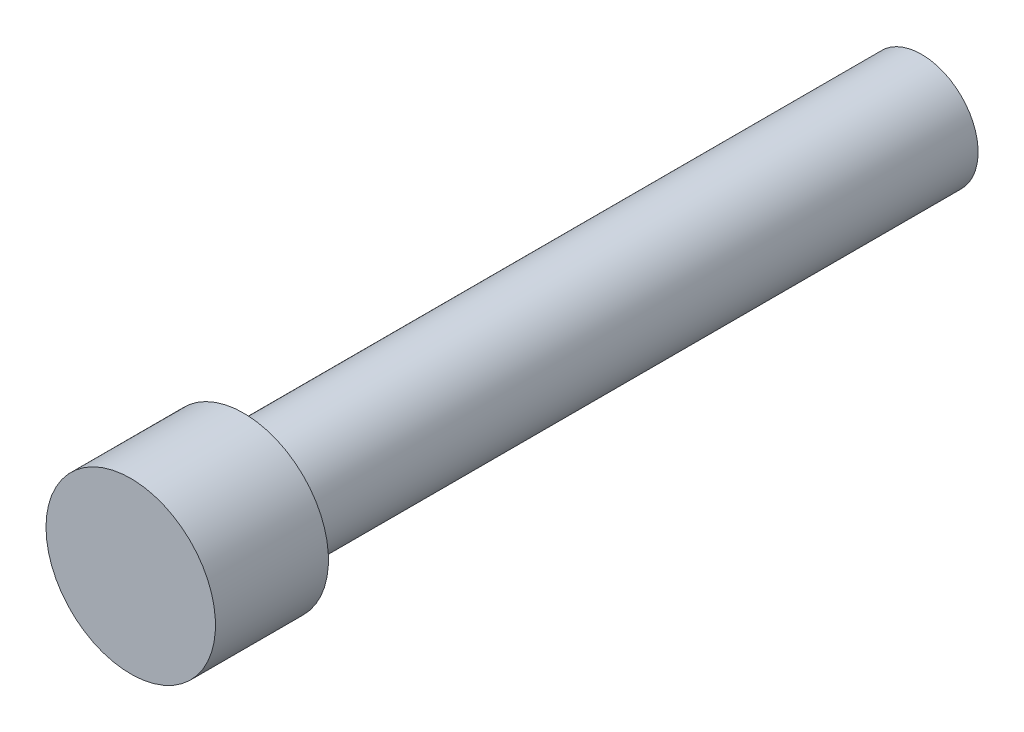
ISO-10303-21;
HEADER;
FILE_DESCRIPTION(('STEP AP214'),'2;1');
FILE_NAME('part.step','',(''),(''),'','','');
FILE_SCHEMA(('AUTOMOTIVE_DESIGN { 1 0 10303 214 1 1 1 1 }'));
ENDSEC;
DATA;
#1=APPLICATION_CONTEXT('core data for automotive mechanical design processes');
#2=APPLICATION_PROTOCOL_DEFINITION('international standard','automotive_design',2000,#1);
#3=PRODUCT_CONTEXT('',#1,'mechanical');
#4=PRODUCT('Part','Part','',(#3));
#5=PRODUCT_RELATED_PRODUCT_CATEGORY('part','',(#4));
#6=PRODUCT_DEFINITION_FORMATION('','',#4);
#7=PRODUCT_DEFINITION_CONTEXT('part definition',#1,'design');
#8=PRODUCT_DEFINITION('design','',#6,#7);
#9=PRODUCT_DEFINITION_SHAPE('','',#8);
#10=(LENGTH_UNIT() NAMED_UNIT(*) SI_UNIT(.MILLI.,.METRE.));
#11=(NAMED_UNIT(*) PLANE_ANGLE_UNIT() SI_UNIT($,.RADIAN.));
#12=(NAMED_UNIT(*) SI_UNIT($,.STERADIAN.) SOLID_ANGLE_UNIT());
#13=UNCERTAINTY_MEASURE_WITH_UNIT(LENGTH_MEASURE(1.E-05),#10,'distance_accuracy_value','');
#14=(GEOMETRIC_REPRESENTATION_CONTEXT(3) GLOBAL_UNCERTAINTY_ASSIGNED_CONTEXT((#13)) GLOBAL_UNIT_ASSIGNED_CONTEXT((#10,
#11,#12)) REPRESENTATION_CONTEXT('',''));
#15=CARTESIAN_POINT('',(0.,0.,0.));
#16=DIRECTION('',(0.,0.,1.));
#17=DIRECTION('',(1.,0.,0.));
#18=AXIS2_PLACEMENT_3D('',#15,#16,#17);
#19=CARTESIAN_POINT('',(0.,0.,22.225));
#20=DIRECTION('',(0.,0.,1.));
#21=DIRECTION('',(1.,0.,0.));
#22=AXIS2_PLACEMENT_3D('',#19,#20,#21);
#23=PLANE('',#22);
#24=CARTESIAN_POINT('',(0.,0.,22.225));
#25=DIRECTION('',(0.,0.,-1.));
#26=DIRECTION('',(-1.,0.,0.));
#27=AXIS2_PLACEMENT_3D('',#24,#25,#26);
#28=CIRCLE('',#27,4.7625);
#29=CARTESIAN_POINT('',(-4.7625,0.,22.225));
#30=VERTEX_POINT('',#29);
#31=EDGE_CURVE('E55',#30,#30,#28,.T.);
#32=ORIENTED_EDGE('',*,*,#31,.F.);
#33=EDGE_LOOP('',(#32));
#34=FACE_BOUND('',#33,.T.);
#35=ADVANCED_FACE('F41',(#34),#23,.T.);
#36=CARTESIAN_POINT('',(0.,1.38777878078143E-13,-22.225));
#37=DIRECTION('',(0.,0.,-1.));
#38=DIRECTION('',(-1.,0.,0.));
#39=AXIS2_PLACEMENT_3D('',#36,#37,#38);
#40=PLANE('',#39);
#41=CARTESIAN_POINT('',(0.,0.,-22.225));
#42=DIRECTION('',(0.,0.,-1.));
#43=DIRECTION('',(-1.,0.,0.));
#44=AXIS2_PLACEMENT_3D('',#41,#42,#43);
#45=CIRCLE('',#44,3.17500000000002);
#46=CARTESIAN_POINT('',(-3.17500000000002,0.,-22.225));
#47=VERTEX_POINT('',#46);
#48=EDGE_CURVE('E10',#47,#47,#45,.T.);
#49=ORIENTED_EDGE('',*,*,#48,.T.);
#50=EDGE_LOOP('',(#49));
#51=FACE_BOUND('',#50,.T.);
#52=ADVANCED_FACE('F65',(#51),#40,.T.);
#53=CARTESIAN_POINT('',(0.,0.,-22.225));
#54=DIRECTION('',(0.,0.,-1.));
#55=DIRECTION('',(-1.,0.,0.));
#56=AXIS2_PLACEMENT_3D('',#53,#54,#55);
#57=CYLINDRICAL_SURFACE('',#56,3.17500000000002);
#58=CARTESIAN_POINT('',(0.,0.,15.875));
#59=DIRECTION('',(0.,0.,-1.));
#60=DIRECTION('',(-1.,0.,0.));
#61=AXIS2_PLACEMENT_3D('',#58,#59,#60);
#62=CIRCLE('',#61,3.17500000000001);
#63=CARTESIAN_POINT('',(-3.17500000000001,0.,15.875));
#64=VERTEX_POINT('',#63);
#65=EDGE_CURVE('E47',#64,#64,#62,.T.);
#66=ORIENTED_EDGE('',*,*,#65,.T.);
#67=EDGE_LOOP('',(#66));
#68=FACE_BOUND('',#67,.T.);
#69=ORIENTED_EDGE('',*,*,#48,.F.);
#70=EDGE_LOOP('',(#69));
#71=FACE_BOUND('',#70,.T.);
#72=ADVANCED_FACE('F69',(#68,#71),#57,.T.);
#73=CARTESIAN_POINT('',(0.,0.,15.875));
#74=DIRECTION('',(0.,0.,-1.));
#75=DIRECTION('',(-1.,0.,0.));
#76=AXIS2_PLACEMENT_3D('',#73,#74,#75);
#77=PLANE('',#76);
#78=CARTESIAN_POINT('',(0.,0.,15.875));
#79=DIRECTION('',(0.,0.,-1.));
#80=DIRECTION('',(-1.,0.,0.));
#81=AXIS2_PLACEMENT_3D('',#78,#79,#80);
#82=CIRCLE('',#81,4.7625);
#83=CARTESIAN_POINT('',(-4.7625,0.,15.875));
#84=VERTEX_POINT('',#83);
#85=EDGE_CURVE('E51',#84,#84,#82,.T.);
#86=ORIENTED_EDGE('',*,*,#85,.T.);
#87=EDGE_LOOP('',(#86));
#88=FACE_BOUND('',#87,.T.);
#89=ORIENTED_EDGE('',*,*,#65,.F.);
#90=EDGE_LOOP('',(#89));
#91=FACE_BOUND('',#90,.T.);
#92=ADVANCED_FACE('F74',(#88,#91),#77,.T.);
#93=CARTESIAN_POINT('',(0.,0.,-22.225));
#94=DIRECTION('',(0.,0.,-1.));
#95=DIRECTION('',(-1.,0.,0.));
#96=AXIS2_PLACEMENT_3D('',#93,#94,#95);
#97=CYLINDRICAL_SURFACE('',#96,4.7625);
#98=ORIENTED_EDGE('',*,*,#31,.T.);
#99=EDGE_LOOP('',(#98));
#100=FACE_BOUND('',#99,.T.);
#101=ORIENTED_EDGE('',*,*,#85,.F.);
#102=EDGE_LOOP('',(#101));
#103=FACE_BOUND('',#102,.T.);
#104=ADVANCED_FACE('F61',(#100,#103),#97,.T.);
#105=CLOSED_SHELL('',(#35,#52,#72,#92,#104));
#106=MANIFOLD_SOLID_BREP('B2',#105);
#107=ADVANCED_BREP_SHAPE_REPRESENTATION('',(#18,#106),#14);
#108=SHAPE_DEFINITION_REPRESENTATION(#9,#107);
ENDSEC;
END-ISO-10303-21;
